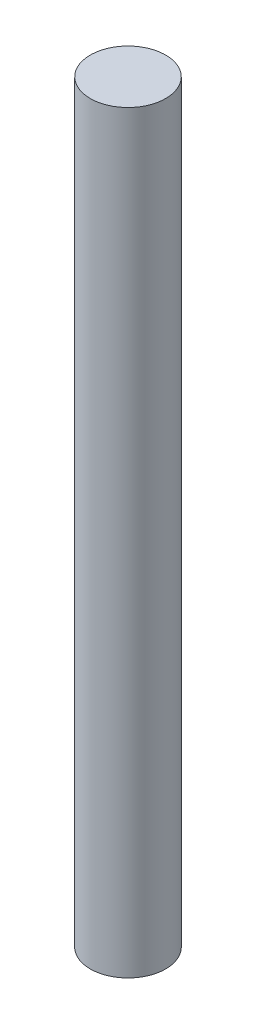
ISO-10303-21;
HEADER;
FILE_DESCRIPTION(('STEP AP214'),'2;1');
FILE_NAME('part.step','',(''),(''),'','','');
FILE_SCHEMA(('AUTOMOTIVE_DESIGN { 1 0 10303 214 1 1 1 1 }'));
ENDSEC;
DATA;
#1=APPLICATION_CONTEXT('core data for automotive mechanical design processes');
#2=APPLICATION_PROTOCOL_DEFINITION('international standard','automotive_design',2000,#1);
#3=PRODUCT_CONTEXT('',#1,'mechanical');
#4=PRODUCT('Part','Part','',(#3));
#5=PRODUCT_RELATED_PRODUCT_CATEGORY('part','',(#4));
#6=PRODUCT_DEFINITION_FORMATION('','',#4);
#7=PRODUCT_DEFINITION_CONTEXT('part definition',#1,'design');
#8=PRODUCT_DEFINITION('design','',#6,#7);
#9=PRODUCT_DEFINITION_SHAPE('','',#8);
#10=(LENGTH_UNIT() NAMED_UNIT(*) SI_UNIT(.MILLI.,.METRE.));
#11=(NAMED_UNIT(*) PLANE_ANGLE_UNIT() SI_UNIT($,.RADIAN.));
#12=(NAMED_UNIT(*) SI_UNIT($,.STERADIAN.) SOLID_ANGLE_UNIT());
#13=UNCERTAINTY_MEASURE_WITH_UNIT(LENGTH_MEASURE(1.E-05),#10,'distance_accuracy_value','');
#14=(GEOMETRIC_REPRESENTATION_CONTEXT(3) GLOBAL_UNCERTAINTY_ASSIGNED_CONTEXT((#13)) GLOBAL_UNIT_ASSIGNED_CONTEXT((#10,
#11,#12)) REPRESENTATION_CONTEXT('',''));
#15=CARTESIAN_POINT('',(0.,0.,0.));
#16=DIRECTION('',(0.,0.,1.));
#17=DIRECTION('',(1.,0.,0.));
#18=AXIS2_PLACEMENT_3D('',#15,#16,#17);
#19=CARTESIAN_POINT('',(0.,25.,0.));
#20=DIRECTION('',(0.,-1.,0.));
#21=DIRECTION('',(0.,0.,-1.));
#22=AXIS2_PLACEMENT_3D('',#19,#20,#21);
#23=CYLINDRICAL_SURFACE('',#22,2.5);
#24=CARTESIAN_POINT('',(0.,25.,0.));
#25=DIRECTION('',(0.,1.,0.));
#26=DIRECTION('',(0.,0.,1.));
#27=AXIS2_PLACEMENT_3D('',#24,#25,#26);
#28=CIRCLE('',#27,2.5);
#29=CARTESIAN_POINT('',(0.,25.,2.5));
#30=VERTEX_POINT('',#29);
#31=EDGE_CURVE('E10',#30,#30,#28,.T.);
#32=ORIENTED_EDGE('',*,*,#31,.F.);
#33=EDGE_LOOP('',(#32));
#34=FACE_BOUND('',#33,.T.);
#35=CARTESIAN_POINT('',(0.,-25.,0.));
#36=DIRECTION('',(0.,1.,0.));
#37=DIRECTION('',(0.,0.,1.));
#38=AXIS2_PLACEMENT_3D('',#35,#36,#37);
#39=CIRCLE('',#38,2.5);
#40=CARTESIAN_POINT('',(0.,-25.,2.5));
#41=VERTEX_POINT('',#40);
#42=EDGE_CURVE('E42',#41,#41,#39,.T.);
#43=ORIENTED_EDGE('',*,*,#42,.T.);
#44=EDGE_LOOP('',(#43));
#45=FACE_BOUND('',#44,.T.);
#46=ADVANCED_FACE('F39',(#34,#45),#23,.T.);
#47=CARTESIAN_POINT('',(0.,25.,0.));
#48=DIRECTION('',(0.,1.,0.));
#49=DIRECTION('',(0.,0.,1.));
#50=AXIS2_PLACEMENT_3D('',#47,#48,#49);
#51=PLANE('',#50);
#52=ORIENTED_EDGE('',*,*,#31,.T.);
#53=EDGE_LOOP('',(#52));
#54=FACE_BOUND('',#53,.T.);
#55=ADVANCED_FACE('F54',(#54),#51,.T.);
#56=CARTESIAN_POINT('',(0.,-25.,0.));
#57=DIRECTION('',(0.,1.,0.));
#58=DIRECTION('',(0.,0.,1.));
#59=AXIS2_PLACEMENT_3D('',#56,#57,#58);
#60=PLANE('',#59);
#61=ORIENTED_EDGE('',*,*,#42,.F.);
#62=EDGE_LOOP('',(#61));
#63=FACE_BOUND('',#62,.T.);
#64=ADVANCED_FACE('F52',(#63),#60,.F.);
#65=CLOSED_SHELL('',(#46,#55,#64));
#66=MANIFOLD_SOLID_BREP('B2',#65);
#67=ADVANCED_BREP_SHAPE_REPRESENTATION('',(#18,#66),#14);
#68=SHAPE_DEFINITION_REPRESENTATION(#9,#67);
ENDSEC;
END-ISO-10303-21;
